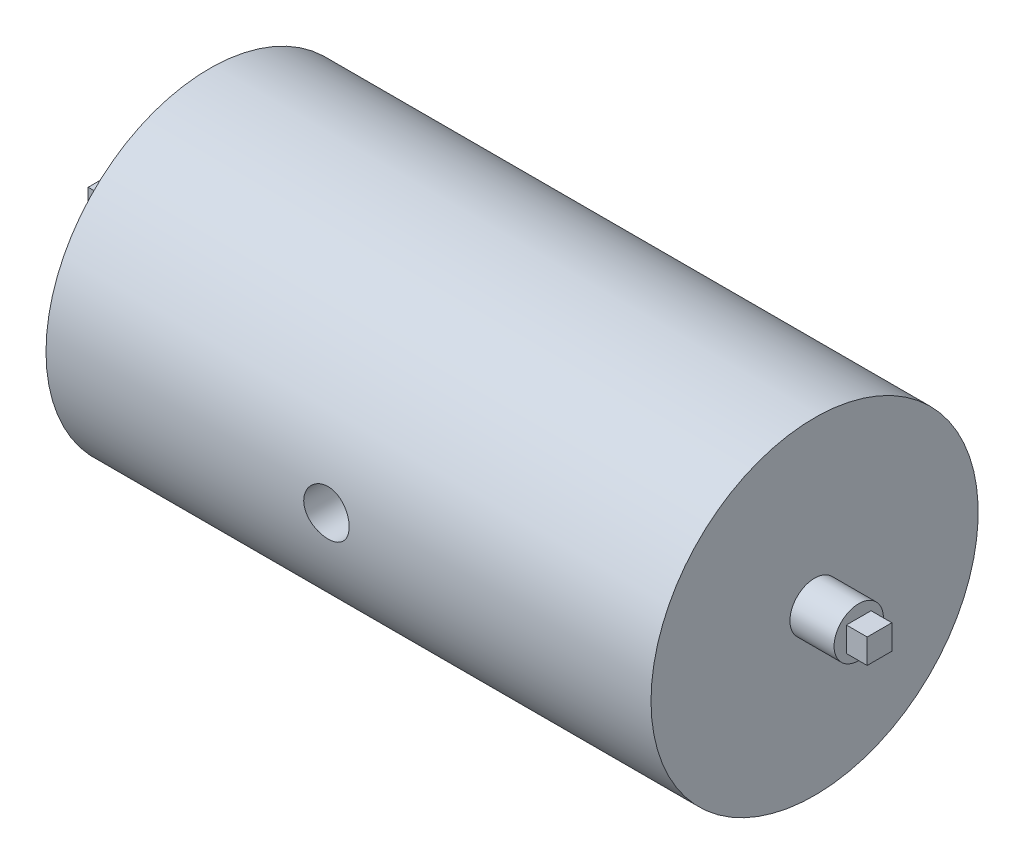
ISO-10303-21;
HEADER;
FILE_DESCRIPTION(('STEP AP214'),'2;1');
FILE_NAME('part.step','',(''),(''),'','','');
FILE_SCHEMA(('AUTOMOTIVE_DESIGN { 1 0 10303 214 1 1 1 1 }'));
ENDSEC;
DATA;
#1=APPLICATION_CONTEXT('core data for automotive mechanical design processes');
#2=APPLICATION_PROTOCOL_DEFINITION('international standard','automotive_design',2000,#1);
#3=PRODUCT_CONTEXT('',#1,'mechanical');
#4=PRODUCT('Part','Part','',(#3));
#5=PRODUCT_RELATED_PRODUCT_CATEGORY('part','',(#4));
#6=PRODUCT_DEFINITION_FORMATION('','',#4);
#7=PRODUCT_DEFINITION_CONTEXT('part definition',#1,'design');
#8=PRODUCT_DEFINITION('design','',#6,#7);
#9=PRODUCT_DEFINITION_SHAPE('','',#8);
#10=(LENGTH_UNIT() NAMED_UNIT(*) SI_UNIT(.MILLI.,.METRE.));
#11=(NAMED_UNIT(*) PLANE_ANGLE_UNIT() SI_UNIT($,.RADIAN.));
#12=(NAMED_UNIT(*) SI_UNIT($,.STERADIAN.) SOLID_ANGLE_UNIT());
#13=UNCERTAINTY_MEASURE_WITH_UNIT(LENGTH_MEASURE(1.E-05),#10,'distance_accuracy_value','');
#14=(GEOMETRIC_REPRESENTATION_CONTEXT(3) GLOBAL_UNCERTAINTY_ASSIGNED_CONTEXT((#13)) GLOBAL_UNIT_ASSIGNED_CONTEXT((#10,
#11,#12)) REPRESENTATION_CONTEXT('',''));
#15=CARTESIAN_POINT('',(0.,0.,0.));
#16=DIRECTION('',(0.,0.,1.));
#17=DIRECTION('',(1.,0.,0.));
#18=AXIS2_PLACEMENT_3D('',#15,#16,#17);
#19=CARTESIAN_POINT('',(0.,0.,-4.75));
#20=DIRECTION('',(-1.,0.,0.));
#21=DIRECTION('',(0.,0.,1.));
#22=AXIS2_PLACEMENT_3D('',#19,#20,#21);
#23=CYLINDRICAL_SURFACE('',#22,31.5);
#24=CARTESIAN_POINT('',(17.,0.,-4.75));
#25=DIRECTION('',(-1.,0.,0.));
#26=DIRECTION('',(0.,0.,1.));
#27=AXIS2_PLACEMENT_3D('',#24,#25,#26);
#28=CIRCLE('',#27,31.5);
#29=CARTESIAN_POINT('',(17.,0.,26.75));
#30=VERTEX_POINT('',#29);
#31=EDGE_CURVE('E296',#30,#30,#28,.T.);
#32=ORIENTED_EDGE('',*,*,#31,.F.);
#33=EDGE_LOOP('',(#32));
#34=FACE_BOUND('',#33,.T.);
#35=CARTESIAN_POINT('',(133.5,0.,-4.75));
#36=DIRECTION('',(-1.,0.,0.));
#37=DIRECTION('',(0.,0.,1.));
#38=AXIS2_PLACEMENT_3D('',#35,#36,#37);
#39=CIRCLE('',#38,31.5);
#40=CARTESIAN_POINT('',(133.5,0.,26.75));
#41=VERTEX_POINT('',#40);
#42=EDGE_CURVE('E300',#41,#41,#39,.T.);
#43=ORIENTED_EDGE('',*,*,#42,.T.);
#44=EDGE_LOOP('',(#43));
#45=FACE_BOUND('',#44,.T.);
#46=CARTESIAN_POINT('',(63.31,0.,-4.75));
#47=DIRECTION('',(-0.866025403784438,0.5,0.));
#48=DIRECTION('',(-0.5,-0.866025403784439,0.));
#49=AXIS2_PLACEMENT_3D('',#46,#47,#48);
#50=ELLIPSE('',#49,36.3730669589464,31.5);
#51=CARTESIAN_POINT('',(63.31,0.,-36.25));
#52=VERTEX_POINT('',#51);
#53=CARTESIAN_POINT('',(67.155,6.65973535510233,-35.5379509711186));
#54=VERTEX_POINT('',#53);
#55=EDGE_CURVE('E11',#52,#54,#50,.F.);
#56=ORIENTED_EDGE('',*,*,#55,.F.);
#57=CARTESIAN_POINT('',(63.31,0.,-4.75));
#58=DIRECTION('',(-0.866025403784438,-0.5,0.));
#59=DIRECTION('',(-0.5,0.866025403784438,0.));
#60=AXIS2_PLACEMENT_3D('',#57,#58,#59);
#61=ELLIPSE('',#60,36.3730669589464,31.5);
#62=CARTESIAN_POINT('',(67.155,-6.65973535510232,-35.5379509711186));
#63=VERTEX_POINT('',#62);
#64=EDGE_CURVE('E145',#63,#52,#61,.F.);
#65=ORIENTED_EDGE('',*,*,#64,.F.);
#66=DIRECTION('',(-1.,0.,0.));
#67=VECTOR('',#66,1.);
#68=CARTESIAN_POINT('',(0.,-6.65973535510232,-35.5379509711186));
#69=LINE('',#68,#67);
#70=CARTESIAN_POINT('',(74.845,-6.65973535510233,-35.5379509711186));
#71=VERTEX_POINT('',#70);
#72=EDGE_CURVE('E318',#71,#63,#69,.T.);
#73=ORIENTED_EDGE('',*,*,#72,.F.);
#74=CARTESIAN_POINT('',(78.69,0.,-4.75));
#75=DIRECTION('',(0.866025403784438,-0.500000000000001,0.));
#76=DIRECTION('',(-0.500000000000001,-0.866025403784438,0.));
#77=AXIS2_PLACEMENT_3D('',#74,#75,#76);
#78=ELLIPSE('',#77,36.3730669589465,31.5);
#79=CARTESIAN_POINT('',(78.69,0.,-36.25));
#80=VERTEX_POINT('',#79);
#81=EDGE_CURVE('E321',#80,#71,#78,.F.);
#82=ORIENTED_EDGE('',*,*,#81,.F.);
#83=CARTESIAN_POINT('',(78.69,0.,-4.75));
#84=DIRECTION('',(0.866025403784438,0.500000000000001,0.));
#85=DIRECTION('',(-0.500000000000001,0.866025403784438,0.));
#86=AXIS2_PLACEMENT_3D('',#83,#84,#85);
#87=ELLIPSE('',#86,36.3730669589465,31.5);
#88=CARTESIAN_POINT('',(74.845,6.65973535510233,-35.5379509711186));
#89=VERTEX_POINT('',#88);
#90=EDGE_CURVE('E324',#89,#80,#87,.F.);
#91=ORIENTED_EDGE('',*,*,#90,.F.);
#92=DIRECTION('',(-1.,0.,0.));
#93=VECTOR('',#92,1.);
#94=CARTESIAN_POINT('',(0.,6.65973535510233,-35.5379509711186));
#95=LINE('',#94,#93);
#96=EDGE_CURVE('E50',#54,#89,#95,.F.);
#97=ORIENTED_EDGE('',*,*,#96,.F.);
#98=EDGE_LOOP('',(#56,#65,#73,#82,#91,#97));
#99=FACE_BOUND('',#98,.T.);
#100=CARTESIAN_POINT('',(75.375,0.,26.75));
#101=CARTESIAN_POINT('',(75.374989767447,-0.244483551436178,26.7499962939464));
#102=CARTESIAN_POINT('',(75.3544375252358,-0.489114067436838,26.7471237668412));
#103=CARTESIAN_POINT('',(75.2727842816762,-0.971551559779698,26.7359410700169));
#104=CARTESIAN_POINT('',(75.2116424643773,-1.20935141599318,26.7276254269425));
#105=CARTESIAN_POINT('',(75.05066018136,-1.67107477619038,26.7064920687307));
#106=CARTESIAN_POINT('',(74.9508474793569,-1.89500810215663,26.6936775841491));
#107=CARTESIAN_POINT('',(74.7154213822643,-2.32290865123324,26.6649668352355));
#108=CARTESIAN_POINT('',(74.5798135016511,-2.52687894314762,26.6490710456983));
#109=CARTESIAN_POINT('',(74.2756713922518,-2.91047601892358,26.6158488784394));
#110=CARTESIAN_POINT('',(74.1069438062952,-3.08994881576681,26.5985144624671));
#111=CARTESIAN_POINT('',(73.7417676329772,-3.41812881902964,26.5644325282382));
#112=CARTESIAN_POINT('',(73.5453175397683,-3.56683435313224,26.5476850419244));
#113=CARTESIAN_POINT('',(73.1292533656299,-3.82984651489176,26.5165948068557));
#114=CARTESIAN_POINT('',(72.9095456008888,-3.94400627520036,26.5022624369139));
#115=CARTESIAN_POINT('',(72.4538432826695,-4.13374806735286,26.4777334406268));
#116=CARTESIAN_POINT('',(72.2178494904063,-4.20933190086564,26.4675366211372));
#117=CARTESIAN_POINT('',(71.7378844694508,-4.31930264464039,26.4525113803306));
#118=CARTESIAN_POINT('',(71.4939743744283,-4.35395162417458,26.4476488229923));
#119=CARTESIAN_POINT('',(71.0037569047689,-4.38188053849133,26.4437386961765));
#120=CARTESIAN_POINT('',(70.7574496490592,-4.37516251522451,26.4446908396748));
#121=CARTESIAN_POINT('',(70.2712692314071,-4.32076273310391,26.4522713015555));
#122=CARTESIAN_POINT('',(70.0313628613332,-4.27337135157993,26.4588593824905));
#123=CARTESIAN_POINT('',(69.5629408298947,-4.1394239787597,26.476906608034));
#124=CARTESIAN_POINT('',(69.3344254485566,-4.05286702517735,26.4883658723255));
#125=CARTESIAN_POINT('',(68.8943799497153,-3.84273883982006,26.5149093040031));
#126=CARTESIAN_POINT('',(68.6829100361665,-3.71904312870982,26.5300056276965));
#127=CARTESIAN_POINT('',(68.2836186342777,-3.43823752635319,26.5621131546397));
#128=CARTESIAN_POINT('',(68.0957984801555,-3.28112575125934,26.5791244658226));
#129=CARTESIAN_POINT('',(67.7474540060754,-2.93634675293564,26.6133235373442));
#130=CARTESIAN_POINT('',(67.5871770071602,-2.74842957266265,26.6305115619595));
#131=CARTESIAN_POINT('',(67.3003999789738,-2.34823000708547,26.6629917735905));
#132=CARTESIAN_POINT('',(67.1739000620081,-2.13594754077249,26.6782839543026));
#133=CARTESIAN_POINT('',(66.9582612193736,-1.69283998356401,26.7052622724266));
#134=CARTESIAN_POINT('',(66.8691396967676,-1.46200631485416,26.7169467294466));
#135=CARTESIAN_POINT('',(66.7309937477096,-0.988451162914559,26.7353785505929));
#136=CARTESIAN_POINT('',(66.6819670003538,-0.745730368638471,26.7421262004861));
#137=CARTESIAN_POINT('',(66.625727275009,-0.257427277582794,26.7498866180772));
#138=CARTESIAN_POINT('',(66.6181739670612,-0.0118848914878023,26.7509460614498));
#139=CARTESIAN_POINT('',(66.644194617917,0.476962578938893,26.7473372702792));
#140=CARTESIAN_POINT('',(66.6777674898333,0.720267722225493,26.7426691871038));
#141=CARTESIAN_POINT('',(66.7848045946113,1.19671572758066,26.728158781835));
#142=CARTESIAN_POINT('',(66.8581046653975,1.42989617381336,26.7183377581894));
#143=CARTESIAN_POINT('',(67.0423434731979,1.8806565964868,26.6946198926065));
#144=CARTESIAN_POINT('',(67.1532837547643,2.09823593229788,26.6807228834158));
#145=CARTESIAN_POINT('',(67.4104638557968,2.51312533674921,26.6502833928764));
#146=CARTESIAN_POINT('',(67.556921552681,2.71029914553319,26.6337248043824));
#147=CARTESIAN_POINT('',(67.88067348183,3.07738960469143,26.5998599725502));
#148=CARTESIAN_POINT('',(68.0579692387055,3.24730490662658,26.5825536922785));
#149=CARTESIAN_POINT('',(68.4398723135493,3.55627910064402,26.5489978358134));
#150=CARTESIAN_POINT('',(68.6446641067514,3.69511101668964,26.5327566084069));
#151=CARTESIAN_POINT('',(69.074860064788,3.93640434280411,26.5033127706346));
#152=CARTESIAN_POINT('',(69.3002637372169,4.03886662143664,26.4901100877063));
#153=CARTESIAN_POINT('',(69.7645824102466,4.20415300010695,26.468297090839));
#154=CARTESIAN_POINT('',(70.0034527797991,4.26710050960641,26.4596724921439));
#155=CARTESIAN_POINT('',(70.488502180221,4.35196557427412,26.447952843011));
#156=CARTESIAN_POINT('',(70.7346807831746,4.3738855269163,26.4448574694696));
#157=CARTESIAN_POINT('',(71.2250983401101,4.37602228287063,26.4445576057088));
#158=CARTESIAN_POINT('',(71.4693357847706,4.35659580444575,26.4473027262805));
#159=CARTESIAN_POINT('',(71.9510361294516,4.27735135923921,26.4582655868275));
#160=CARTESIAN_POINT('',(72.1884990345046,4.21753342246266,26.4664833227374));
#161=CARTESIAN_POINT('',(72.6498348026537,4.05932353180831,26.4874488113869));
#162=CARTESIAN_POINT('',(72.8737151094778,3.96095293070782,26.5001940561556));
#163=CARTESIAN_POINT('',(73.3018505421083,3.72846521955434,26.5287820156806));
#164=CARTESIAN_POINT('',(73.5061051964201,3.59434725098419,26.5446248048257));
#165=CARTESIAN_POINT('',(73.8910091989072,3.29286265200486,26.5777860418109));
#166=CARTESIAN_POINT('',(74.0714499752786,3.12523093374305,26.5951155822017));
#167=CARTESIAN_POINT('',(74.4017710052008,2.76203584618229,26.629202587307));
#168=CARTESIAN_POINT('',(74.5516441028606,2.56646595473814,26.6459599173045));
#169=CARTESIAN_POINT('',(74.8171918419093,2.15187679652751,26.6771030635672));
#170=CARTESIAN_POINT('',(74.9327027267489,1.93275181197701,26.6914773839249));
#171=CARTESIAN_POINT('',(75.1251146130084,1.47812489689791,26.7161208895794));
#172=CARTESIAN_POINT('',(75.2020565239878,1.24264062169142,26.726394422156));
#173=CARTESIAN_POINT('',(75.2972394541755,0.838351544663169,26.7392719999721));
#174=CARTESIAN_POINT('',(75.3263563489892,0.672068838629243,26.743274838411));
#175=CARTESIAN_POINT('',(75.3652400551769,0.337214048921173,26.7486401035394));
#176=CARTESIAN_POINT('',(75.3750070582993,0.168641987950137,26.7500025563939));
#177=CARTESIAN_POINT('',(75.375,0.,26.75));
#178=B_SPLINE_CURVE_WITH_KNOTS('',3,(#100,#101,#102,#103,#104,#105,#106,#107,#108,#109,#110,
#111,#112,#113,#114,#115,#116,#117,#118,#119,#120,#121,#122,#123,#124,#125,#126,#127,#128,#129,
#130,#131,#132,#133,#134,#135,#136,#137,#138,#139,#140,#141,#142,#143,#144,#145,#146,#147,#148,
#149,#150,#151,#152,#153,#154,#155,#156,#157,#158,#159,#160,#161,#162,#163,#164,#165,#166,#167,
#168,#169,#170,#171,#172,#173,#174,#175,#176,#177),.UNSPECIFIED.,.T.,.F.,(4,2,2,2,2,2,2,2,2,2,2,
2,2,2,2,2,2,2,2,2,2,2,2,2,2,2,2,2,2,2,2,2,2,2,2,2,2,2,4),(0.,0.732834532707116,1.46640710560907,
2.19945398401452,2.93238799770189,3.66973556322692,4.40712319585619,5.14760307348409,
5.88804836421318,6.62372710503621,7.35936953170744,8.08980329947269,8.82025501474624,
9.55318287417539,10.2861520637394,11.0253932220231,11.7646368381788,12.5042242588164,
13.243768865079,13.9772356151546,14.7106829815068,15.4411224259943,16.1715918474191,
16.9066609325545,17.6417663692943,18.3820762511418,19.1223684520443,19.8603369742038,
20.598262371311,21.3298471029177,22.0614312910616,22.7926108553465,23.5238079813938,
24.2610354763769,24.9984353586611,25.7392950788736,26.4793673081301,26.9848732876236,
27.4903742577636),.UNSPECIFIED.);
#179=CARTESIAN_POINT('',(75.375,0.,26.75));
#180=VERTEX_POINT('',#179);
#181=EDGE_CURVE('E168',#180,#180,#178,.T.);
#182=ORIENTED_EDGE('',*,*,#181,.T.);
#183=EDGE_LOOP('',(#182));
#184=FACE_BOUND('',#183,.T.);
#185=ADVANCED_FACE('F41',(#34,#45,#99,#184),#23,.T.);
#186=CARTESIAN_POINT('',(0.,0.,-4.75));
#187=DIRECTION('',(-1.,0.,0.));
#188=DIRECTION('',(0.,0.,1.));
#189=AXIS2_PLACEMENT_3D('',#186,#187,#188);
#190=CYLINDRICAL_SURFACE('',#189,4.75);
#191=CARTESIAN_POINT('',(17.,0.,-4.75));
#192=DIRECTION('',(-1.,0.,0.));
#193=DIRECTION('',(0.,0.,1.));
#194=AXIS2_PLACEMENT_3D('',#191,#192,#193);
#195=CIRCLE('',#194,4.75);
#196=CARTESIAN_POINT('',(17.,0.,0.));
#197=VERTEX_POINT('',#196);
#198=EDGE_CURVE('E292',#197,#197,#195,.T.);
#199=ORIENTED_EDGE('',*,*,#198,.T.);
#200=EDGE_LOOP('',(#199));
#201=FACE_BOUND('',#200,.T.);
#202=CARTESIAN_POINT('',(0.,0.,-4.75));
#203=DIRECTION('',(-1.,0.,0.));
#204=DIRECTION('',(0.,0.,1.));
#205=AXIS2_PLACEMENT_3D('',#202,#203,#204);
#206=CIRCLE('',#205,4.75);
#207=CARTESIAN_POINT('',(0.,0.,0.));
#208=VERTEX_POINT('',#207);
#209=EDGE_CURVE('E312',#208,#208,#206,.T.);
#210=ORIENTED_EDGE('',*,*,#209,.F.);
#211=EDGE_LOOP('',(#210));
#212=FACE_BOUND('',#211,.T.);
#213=ADVANCED_FACE('F43',(#201,#212),#190,.T.);
#214=CARTESIAN_POINT('',(0.,0.,0.));
#215=DIRECTION('',(-1.,0.,0.));
#216=DIRECTION('',(0.,0.,1.));
#217=AXIS2_PLACEMENT_3D('',#214,#215,#216);
#218=PLANE('',#217);
#219=DIRECTION('',(0.,0.,-1.));
#220=VECTOR('',#219,1.);
#221=CARTESIAN_POINT('',(0.,2.375,-4.75));
#222=LINE('',#221,#220);
#223=CARTESIAN_POINT('',(0.,2.375,-2.375));
#224=VERTEX_POINT('',#223);
#225=CARTESIAN_POINT('',(0.,2.375,-7.125));
#226=VERTEX_POINT('',#225);
#227=EDGE_CURVE('E65',#224,#226,#222,.T.);
#228=ORIENTED_EDGE('',*,*,#227,.F.);
#229=DIRECTION('',(0.,1.,0.));
#230=VECTOR('',#229,1.);
#231=CARTESIAN_POINT('',(0.,-2.375,-2.375));
#232=LINE('',#231,#230);
#233=CARTESIAN_POINT('',(0.,-2.375,-2.375));
#234=VERTEX_POINT('',#233);
#235=EDGE_CURVE('E210',#234,#224,#232,.T.);
#236=ORIENTED_EDGE('',*,*,#235,.F.);
#237=DIRECTION('',(0.,0.,1.));
#238=VECTOR('',#237,1.);
#239=CARTESIAN_POINT('',(0.,-2.375,-7.125));
#240=LINE('',#239,#238);
#241=CARTESIAN_POINT('',(0.,-2.375,-7.125));
#242=VERTEX_POINT('',#241);
#243=EDGE_CURVE('E226',#242,#234,#240,.T.);
#244=ORIENTED_EDGE('',*,*,#243,.F.);
#245=DIRECTION('',(0.,-1.,0.));
#246=VECTOR('',#245,1.);
#247=CARTESIAN_POINT('',(0.,2.375,-7.125));
#248=LINE('',#247,#246);
#249=EDGE_CURVE('E222',#226,#242,#248,.T.);
#250=ORIENTED_EDGE('',*,*,#249,.F.);
#251=EDGE_LOOP('',(#228,#236,#244,#250));
#252=FACE_BOUND('',#251,.T.);
#253=ORIENTED_EDGE('',*,*,#209,.T.);
#254=EDGE_LOOP('',(#253));
#255=FACE_BOUND('',#254,.T.);
#256=ADVANCED_FACE('F358',(#252,#255),#218,.T.);
#257=CARTESIAN_POINT('',(142.,0.,-4.75));
#258=DIRECTION('',(1.,0.,0.));
#259=DIRECTION('',(0.,0.,-1.));
#260=AXIS2_PLACEMENT_3D('',#257,#258,#259);
#261=PLANE('',#260);
#262=DIRECTION('',(0.,0.,1.));
#263=VECTOR('',#262,1.);
#264=CARTESIAN_POINT('',(142.,2.375,-2.375));
#265=LINE('',#264,#263);
#266=CARTESIAN_POINT('',(142.,2.375,-7.125));
#267=VERTEX_POINT('',#266);
#268=CARTESIAN_POINT('',(142.,2.375,-2.375));
#269=VERTEX_POINT('',#268);
#270=EDGE_CURVE('E247',#267,#269,#265,.T.);
#271=ORIENTED_EDGE('',*,*,#270,.F.);
#272=DIRECTION('',(0.,1.,0.));
#273=VECTOR('',#272,1.);
#274=CARTESIAN_POINT('',(142.,2.375,-7.125));
#275=LINE('',#274,#273);
#276=CARTESIAN_POINT('',(142.,-2.375,-7.125));
#277=VERTEX_POINT('',#276);
#278=EDGE_CURVE('E253',#277,#267,#275,.T.);
#279=ORIENTED_EDGE('',*,*,#278,.F.);
#280=DIRECTION('',(0.,0.,-1.));
#281=VECTOR('',#280,1.);
#282=CARTESIAN_POINT('',(142.,-2.375,-7.125));
#283=LINE('',#282,#281);
#284=CARTESIAN_POINT('',(142.,-2.375,-2.375));
#285=VERTEX_POINT('',#284);
#286=EDGE_CURVE('E270',#285,#277,#283,.T.);
#287=ORIENTED_EDGE('',*,*,#286,.F.);
#288=DIRECTION('',(0.,-1.,0.));
#289=VECTOR('',#288,1.);
#290=CARTESIAN_POINT('',(142.,2.375,-2.375));
#291=LINE('',#290,#289);
#292=EDGE_CURVE('E266',#269,#285,#291,.T.);
#293=ORIENTED_EDGE('',*,*,#292,.F.);
#294=EDGE_LOOP('',(#271,#279,#287,#293));
#295=FACE_BOUND('',#294,.T.);
#296=CARTESIAN_POINT('',(142.,0.,-4.75));
#297=DIRECTION('',(-1.,0.,0.));
#298=DIRECTION('',(0.,0.,1.));
#299=AXIS2_PLACEMENT_3D('',#296,#297,#298);
#300=CIRCLE('',#299,4.75);
#301=CARTESIAN_POINT('',(142.,0.,0.));
#302=VERTEX_POINT('',#301);
#303=EDGE_CURVE('E308',#302,#302,#300,.T.);
#304=ORIENTED_EDGE('',*,*,#303,.F.);
#305=EDGE_LOOP('',(#304));
#306=FACE_BOUND('',#305,.T.);
#307=ADVANCED_FACE('F374',(#295,#306),#261,.T.);
#308=CARTESIAN_POINT('',(0.,0.,-4.75));
#309=DIRECTION('',(-1.,0.,0.));
#310=DIRECTION('',(0.,0.,1.));
#311=AXIS2_PLACEMENT_3D('',#308,#309,#310);
#312=CYLINDRICAL_SURFACE('',#311,4.75);
#313=ORIENTED_EDGE('',*,*,#303,.T.);
#314=EDGE_LOOP('',(#313));
#315=FACE_BOUND('',#314,.T.);
#316=CARTESIAN_POINT('',(133.5,0.,-4.75));
#317=DIRECTION('',(-1.,0.,0.));
#318=DIRECTION('',(0.,0.,1.));
#319=AXIS2_PLACEMENT_3D('',#316,#317,#318);
#320=CIRCLE('',#319,4.75);
#321=CARTESIAN_POINT('',(133.5,0.,0.));
#322=VERTEX_POINT('',#321);
#323=EDGE_CURVE('E304',#322,#322,#320,.T.);
#324=ORIENTED_EDGE('',*,*,#323,.F.);
#325=EDGE_LOOP('',(#324));
#326=FACE_BOUND('',#325,.T.);
#327=ADVANCED_FACE('F370',(#315,#326),#312,.T.);
#328=CARTESIAN_POINT('',(133.5,0.,0.));
#329=DIRECTION('',(1.,0.,0.));
#330=DIRECTION('',(0.,0.,-1.));
#331=AXIS2_PLACEMENT_3D('',#328,#329,#330);
#332=PLANE('',#331);
#333=ORIENTED_EDGE('',*,*,#323,.T.);
#334=EDGE_LOOP('',(#333));
#335=FACE_BOUND('',#334,.T.);
#336=ORIENTED_EDGE('',*,*,#42,.F.);
#337=EDGE_LOOP('',(#336));
#338=FACE_BOUND('',#337,.T.);
#339=ADVANCED_FACE('F367',(#335,#338),#332,.T.);
#340=CARTESIAN_POINT('',(17.,0.,26.75));
#341=DIRECTION('',(-1.,0.,0.));
#342=DIRECTION('',(0.,0.,1.));
#343=AXIS2_PLACEMENT_3D('',#340,#341,#342);
#344=PLANE('',#343);
#345=ORIENTED_EDGE('',*,*,#31,.T.);
#346=EDGE_LOOP('',(#345));
#347=FACE_BOUND('',#346,.T.);
#348=ORIENTED_EDGE('',*,*,#198,.F.);
#349=EDGE_LOOP('',(#348));
#350=FACE_BOUND('',#349,.T.);
#351=ADVANCED_FACE('F365',(#347,#350),#344,.T.);
#352=CARTESIAN_POINT('',(146.,2.375,-2.375));
#353=DIRECTION('',(0.,-1.,0.));
#354=DIRECTION('',(0.,0.,-1.));
#355=AXIS2_PLACEMENT_3D('',#352,#353,#354);
#356=PLANE('',#355);
#357=ORIENTED_EDGE('',*,*,#270,.T.);
#358=DIRECTION('',(-1.,0.,0.));
#359=VECTOR('',#358,1.);
#360=CARTESIAN_POINT('',(146.,2.375,-2.375));
#361=LINE('',#360,#359);
#362=CARTESIAN_POINT('',(146.,2.375,-2.375));
#363=VERTEX_POINT('',#362);
#364=EDGE_CURVE('E288',#363,#269,#361,.T.);
#365=ORIENTED_EDGE('',*,*,#364,.F.);
#366=DIRECTION('',(0.,0.,1.));
#367=VECTOR('',#366,1.);
#368=CARTESIAN_POINT('',(146.,2.375,-2.375));
#369=LINE('',#368,#367);
#370=CARTESIAN_POINT('',(146.,2.375,-7.125));
#371=VERTEX_POINT('',#370);
#372=EDGE_CURVE('E248',#371,#363,#369,.T.);
#373=ORIENTED_EDGE('',*,*,#372,.F.);
#374=DIRECTION('',(-1.,0.,0.));
#375=VECTOR('',#374,1.);
#376=CARTESIAN_POINT('',(146.,2.375,-7.125));
#377=LINE('',#376,#375);
#378=EDGE_CURVE('E262',#371,#267,#377,.T.);
#379=ORIENTED_EDGE('',*,*,#378,.T.);
#380=EDGE_LOOP('',(#357,#365,#373,#379));
#381=FACE_BOUND('',#380,.T.);
#382=ADVANCED_FACE('F406',(#381),#356,.F.);
#383=CARTESIAN_POINT('',(146.,2.375,-2.375));
#384=DIRECTION('',(0.,0.,-1.));
#385=DIRECTION('',(0.,1.,0.));
#386=AXIS2_PLACEMENT_3D('',#383,#384,#385);
#387=PLANE('',#386);
#388=ORIENTED_EDGE('',*,*,#292,.T.);
#389=DIRECTION('',(-1.,0.,0.));
#390=VECTOR('',#389,1.);
#391=CARTESIAN_POINT('',(146.,-2.375,-2.375));
#392=LINE('',#391,#390);
#393=CARTESIAN_POINT('',(146.,-2.375,-2.375));
#394=VERTEX_POINT('',#393);
#395=EDGE_CURVE('E284',#394,#285,#392,.T.);
#396=ORIENTED_EDGE('',*,*,#395,.F.);
#397=DIRECTION('',(0.,-1.,0.));
#398=VECTOR('',#397,1.);
#399=CARTESIAN_POINT('',(146.,2.375,-2.375));
#400=LINE('',#399,#398);
#401=EDGE_CURVE('E252',#363,#394,#400,.T.);
#402=ORIENTED_EDGE('',*,*,#401,.F.);
#403=ORIENTED_EDGE('',*,*,#364,.T.);
#404=EDGE_LOOP('',(#388,#396,#402,#403));
#405=FACE_BOUND('',#404,.T.);
#406=ADVANCED_FACE('F413',(#405),#387,.F.);
#407=CARTESIAN_POINT('',(146.,-2.375,-7.125));
#408=DIRECTION('',(0.,1.,0.));
#409=DIRECTION('',(0.,0.,1.));
#410=AXIS2_PLACEMENT_3D('',#407,#408,#409);
#411=PLANE('',#410);
#412=ORIENTED_EDGE('',*,*,#286,.T.);
#413=DIRECTION('',(-1.,0.,0.));
#414=VECTOR('',#413,1.);
#415=CARTESIAN_POINT('',(146.,-2.375,-7.125));
#416=LINE('',#415,#414);
#417=CARTESIAN_POINT('',(146.,-2.375,-7.125));
#418=VERTEX_POINT('',#417);
#419=EDGE_CURVE('E280',#418,#277,#416,.T.);
#420=ORIENTED_EDGE('',*,*,#419,.F.);
#421=DIRECTION('',(0.,0.,-1.));
#422=VECTOR('',#421,1.);
#423=CARTESIAN_POINT('',(146.,-2.375,-7.125));
#424=LINE('',#423,#422);
#425=EDGE_CURVE('E256',#394,#418,#424,.T.);
#426=ORIENTED_EDGE('',*,*,#425,.F.);
#427=ORIENTED_EDGE('',*,*,#395,.T.);
#428=EDGE_LOOP('',(#412,#420,#426,#427));
#429=FACE_BOUND('',#428,.T.);
#430=ADVANCED_FACE('F420',(#429),#411,.F.);
#431=CARTESIAN_POINT('',(146.,2.375,-7.125));
#432=DIRECTION('',(0.,0.,1.));
#433=DIRECTION('',(1.,0.,0.));
#434=AXIS2_PLACEMENT_3D('',#431,#432,#433);
#435=PLANE('',#434);
#436=ORIENTED_EDGE('',*,*,#278,.T.);
#437=ORIENTED_EDGE('',*,*,#378,.F.);
#438=DIRECTION('',(0.,1.,0.));
#439=VECTOR('',#438,1.);
#440=CARTESIAN_POINT('',(146.,2.375,-7.125));
#441=LINE('',#440,#439);
#442=EDGE_CURVE('E259',#418,#371,#441,.T.);
#443=ORIENTED_EDGE('',*,*,#442,.F.);
#444=ORIENTED_EDGE('',*,*,#419,.T.);
#445=EDGE_LOOP('',(#436,#437,#443,#444));
#446=FACE_BOUND('',#445,.T.);
#447=ADVANCED_FACE('F428',(#446),#435,.F.);
#448=CARTESIAN_POINT('',(146.,0.,0.));
#449=DIRECTION('',(-1.,0.,0.));
#450=DIRECTION('',(0.,0.,1.));
#451=AXIS2_PLACEMENT_3D('',#448,#449,#450);
#452=PLANE('',#451);
#453=ORIENTED_EDGE('',*,*,#372,.T.);
#454=ORIENTED_EDGE('',*,*,#401,.T.);
#455=ORIENTED_EDGE('',*,*,#425,.T.);
#456=ORIENTED_EDGE('',*,*,#442,.T.);
#457=EDGE_LOOP('',(#453,#454,#455,#456));
#458=FACE_BOUND('',#457,.T.);
#459=ADVANCED_FACE('F436',(#458),#452,.F.);
#460=CARTESIAN_POINT('',(-4.,2.375,-4.75));
#461=DIRECTION('',(0.,-1.,0.));
#462=DIRECTION('',(0.,0.,-1.));
#463=AXIS2_PLACEMENT_3D('',#460,#461,#462);
#464=PLANE('',#463);
#465=ORIENTED_EDGE('',*,*,#227,.T.);
#466=DIRECTION('',(1.,0.,0.));
#467=VECTOR('',#466,1.);
#468=CARTESIAN_POINT('',(-4.,2.375,-7.125));
#469=LINE('',#468,#467);
#470=CARTESIAN_POINT('',(-4.,2.375,-7.125));
#471=VERTEX_POINT('',#470);
#472=EDGE_CURVE('E243',#471,#226,#469,.T.);
#473=ORIENTED_EDGE('',*,*,#472,.F.);
#474=DIRECTION('',(0.,0.,-1.));
#475=VECTOR('',#474,1.);
#476=CARTESIAN_POINT('',(-4.,2.375,-2.375));
#477=LINE('',#476,#475);
#478=CARTESIAN_POINT('',(-4.,2.375,-2.375));
#479=VERTEX_POINT('',#478);
#480=EDGE_CURVE('E206',#479,#471,#477,.T.);
#481=ORIENTED_EDGE('',*,*,#480,.F.);
#482=DIRECTION('',(1.,0.,0.));
#483=VECTOR('',#482,1.);
#484=CARTESIAN_POINT('',(-4.,2.375,-2.375));
#485=LINE('',#484,#483);
#486=EDGE_CURVE('E219',#479,#224,#485,.T.);
#487=ORIENTED_EDGE('',*,*,#486,.T.);
#488=EDGE_LOOP('',(#465,#473,#481,#487));
#489=FACE_BOUND('',#488,.T.);
#490=ADVANCED_FACE('F444',(#489),#464,.F.);
#491=CARTESIAN_POINT('',(-4.,2.375,-7.125));
#492=DIRECTION('',(0.,0.,1.));
#493=DIRECTION('',(1.,0.,0.));
#494=AXIS2_PLACEMENT_3D('',#491,#492,#493);
#495=PLANE('',#494);
#496=ORIENTED_EDGE('',*,*,#249,.T.);
#497=DIRECTION('',(1.,0.,0.));
#498=VECTOR('',#497,1.);
#499=CARTESIAN_POINT('',(-4.,-2.375,-7.125));
#500=LINE('',#499,#498);
#501=CARTESIAN_POINT('',(-4.,-2.375,-7.125));
#502=VERTEX_POINT('',#501);
#503=EDGE_CURVE('E239',#502,#242,#500,.T.);
#504=ORIENTED_EDGE('',*,*,#503,.F.);
#505=DIRECTION('',(0.,-1.,0.));
#506=VECTOR('',#505,1.);
#507=CARTESIAN_POINT('',(-4.,2.375,-7.125));
#508=LINE('',#507,#506);
#509=EDGE_CURVE('E209',#471,#502,#508,.T.);
#510=ORIENTED_EDGE('',*,*,#509,.F.);
#511=ORIENTED_EDGE('',*,*,#472,.T.);
#512=EDGE_LOOP('',(#496,#504,#510,#511));
#513=FACE_BOUND('',#512,.T.);
#514=ADVANCED_FACE('F451',(#513),#495,.F.);
#515=CARTESIAN_POINT('',(-4.,-2.375,-7.125));
#516=DIRECTION('',(0.,1.,0.));
#517=DIRECTION('',(0.,0.,1.));
#518=AXIS2_PLACEMENT_3D('',#515,#516,#517);
#519=PLANE('',#518);
#520=ORIENTED_EDGE('',*,*,#243,.T.);
#521=DIRECTION('',(1.,0.,0.));
#522=VECTOR('',#521,1.);
#523=CARTESIAN_POINT('',(-4.,-2.375,-2.375));
#524=LINE('',#523,#522);
#525=CARTESIAN_POINT('',(-4.,-2.375,-2.375));
#526=VERTEX_POINT('',#525);
#527=EDGE_CURVE('E235',#526,#234,#524,.T.);
#528=ORIENTED_EDGE('',*,*,#527,.F.);
#529=DIRECTION('',(0.,0.,1.));
#530=VECTOR('',#529,1.);
#531=CARTESIAN_POINT('',(-4.,-2.375,-7.125));
#532=LINE('',#531,#530);
#533=EDGE_CURVE('E213',#502,#526,#532,.T.);
#534=ORIENTED_EDGE('',*,*,#533,.F.);
#535=ORIENTED_EDGE('',*,*,#503,.T.);
#536=EDGE_LOOP('',(#520,#528,#534,#535));
#537=FACE_BOUND('',#536,.T.);
#538=ADVANCED_FACE('F458',(#537),#519,.F.);
#539=CARTESIAN_POINT('',(-4.,-2.375,-2.375));
#540=DIRECTION('',(0.,0.,-1.));
#541=DIRECTION('',(-1.,0.,0.));
#542=AXIS2_PLACEMENT_3D('',#539,#540,#541);
#543=PLANE('',#542);
#544=ORIENTED_EDGE('',*,*,#235,.T.);
#545=ORIENTED_EDGE('',*,*,#486,.F.);
#546=DIRECTION('',(0.,1.,0.));
#547=VECTOR('',#546,1.);
#548=CARTESIAN_POINT('',(-4.,-2.375,-2.375));
#549=LINE('',#548,#547);
#550=EDGE_CURVE('E216',#526,#479,#549,.T.);
#551=ORIENTED_EDGE('',*,*,#550,.F.);
#552=ORIENTED_EDGE('',*,*,#527,.T.);
#553=EDGE_LOOP('',(#544,#545,#551,#552));
#554=FACE_BOUND('',#553,.T.);
#555=ADVANCED_FACE('F466',(#554),#543,.F.);
#556=CARTESIAN_POINT('',(-4.,0.,0.));
#557=DIRECTION('',(-1.,0.,0.));
#558=DIRECTION('',(0.,0.,1.));
#559=AXIS2_PLACEMENT_3D('',#556,#557,#558);
#560=PLANE('',#559);
#561=ORIENTED_EDGE('',*,*,#480,.T.);
#562=ORIENTED_EDGE('',*,*,#509,.T.);
#563=ORIENTED_EDGE('',*,*,#533,.T.);
#564=ORIENTED_EDGE('',*,*,#550,.T.);
#565=EDGE_LOOP('',(#561,#562,#563,#564));
#566=FACE_BOUND('',#565,.T.);
#567=ADVANCED_FACE('F474',(#566),#560,.T.);
#568=CARTESIAN_POINT('',(67.155,6.65973535510233,-50.));
#569=DIRECTION('',(-0.866025403784438,0.5,0.));
#570=DIRECTION('',(-0.5,-0.866025403784439,0.));
#571=AXIS2_PLACEMENT_3D('',#568,#569,#570);
#572=PLANE('',#571);
#573=ORIENTED_EDGE('',*,*,#55,.T.);
#574=DIRECTION('',(0.,0.,1.));
#575=VECTOR('',#574,1.);
#576=CARTESIAN_POINT('',(67.155,6.65973535510233,-50.));
#577=LINE('',#576,#575);
#578=CARTESIAN_POINT('',(67.155,6.65973535510233,0.));
#579=VERTEX_POINT('',#578);
#580=EDGE_CURVE('E166',#54,#579,#577,.T.);
#581=ORIENTED_EDGE('',*,*,#580,.T.);
#582=DIRECTION('',(-0.5,-0.866025403784438,0.));
#583=VECTOR('',#582,1.);
#584=CARTESIAN_POINT('',(67.155,6.65973535510233,0.));
#585=LINE('',#584,#583);
#586=CARTESIAN_POINT('',(63.31,0.,0.));
#587=VERTEX_POINT('',#586);
#588=EDGE_CURVE('E157',#579,#587,#585,.T.);
#589=ORIENTED_EDGE('',*,*,#588,.T.);
#590=DIRECTION('',(0.,0.,1.));
#591=VECTOR('',#590,1.);
#592=CARTESIAN_POINT('',(63.31,0.,-50.));
#593=LINE('',#592,#591);
#594=EDGE_CURVE('E140',#52,#587,#593,.T.);
#595=ORIENTED_EDGE('',*,*,#594,.F.);
#596=EDGE_LOOP('',(#573,#581,#589,#595));
#597=FACE_BOUND('',#596,.T.);
#598=ADVANCED_FACE('F164',(#597),#572,.F.);
#599=CARTESIAN_POINT('',(74.845,6.65973535510233,-50.));
#600=DIRECTION('',(0.,1.,0.));
#601=DIRECTION('',(0.,0.,1.));
#602=AXIS2_PLACEMENT_3D('',#599,#600,#601);
#603=PLANE('',#602);
#604=ORIENTED_EDGE('',*,*,#96,.T.);
#605=DIRECTION('',(0.,0.,1.));
#606=VECTOR('',#605,1.);
#607=CARTESIAN_POINT('',(74.845,6.65973535510233,-50.));
#608=LINE('',#607,#606);
#609=CARTESIAN_POINT('',(74.845,6.65973535510233,0.));
#610=VERTEX_POINT('',#609);
#611=EDGE_CURVE('E195',#89,#610,#608,.T.);
#612=ORIENTED_EDGE('',*,*,#611,.T.);
#613=DIRECTION('',(-1.,0.,0.));
#614=VECTOR('',#613,1.);
#615=CARTESIAN_POINT('',(74.845,6.65973535510233,0.));
#616=LINE('',#615,#614);
#617=EDGE_CURVE('E150',#610,#579,#616,.T.);
#618=ORIENTED_EDGE('',*,*,#617,.T.);
#619=ORIENTED_EDGE('',*,*,#580,.F.);
#620=EDGE_LOOP('',(#604,#612,#618,#619));
#621=FACE_BOUND('',#620,.T.);
#622=ADVANCED_FACE('F330',(#621),#603,.F.);
#623=CARTESIAN_POINT('',(78.69,0.,-50.));
#624=DIRECTION('',(0.866025403784438,0.500000000000001,0.));
#625=DIRECTION('',(-0.500000000000001,0.866025403784438,0.));
#626=AXIS2_PLACEMENT_3D('',#623,#624,#625);
#627=PLANE('',#626);
#628=ORIENTED_EDGE('',*,*,#90,.T.);
#629=DIRECTION('',(0.,0.,1.));
#630=VECTOR('',#629,1.);
#631=CARTESIAN_POINT('',(78.69,0.,-50.));
#632=LINE('',#631,#630);
#633=CARTESIAN_POINT('',(78.69,0.,0.));
#634=VERTEX_POINT('',#633);
#635=EDGE_CURVE('E198',#80,#634,#632,.T.);
#636=ORIENTED_EDGE('',*,*,#635,.T.);
#637=DIRECTION('',(-0.500000000000001,0.866025403784438,0.));
#638=VECTOR('',#637,1.);
#639=CARTESIAN_POINT('',(78.69,0.,0.));
#640=LINE('',#639,#638);
#641=EDGE_CURVE('E187',#634,#610,#640,.T.);
#642=ORIENTED_EDGE('',*,*,#641,.T.);
#643=ORIENTED_EDGE('',*,*,#611,.F.);
#644=EDGE_LOOP('',(#628,#636,#642,#643));
#645=FACE_BOUND('',#644,.T.);
#646=ADVANCED_FACE('F334',(#645),#627,.F.);
#647=CARTESIAN_POINT('',(74.845,-6.65973535510233,-50.));
#648=DIRECTION('',(0.866025403784438,-0.500000000000001,0.));
#649=DIRECTION('',(0.500000000000001,0.866025403784438,0.));
#650=AXIS2_PLACEMENT_3D('',#647,#648,#649);
#651=PLANE('',#650);
#652=ORIENTED_EDGE('',*,*,#81,.T.);
#653=DIRECTION('',(0.,0.,1.));
#654=VECTOR('',#653,1.);
#655=CARTESIAN_POINT('',(74.845,-6.65973535510233,-50.));
#656=LINE('',#655,#654);
#657=CARTESIAN_POINT('',(74.845,-6.65973535510233,0.));
#658=VERTEX_POINT('',#657);
#659=EDGE_CURVE('E201',#71,#658,#656,.T.);
#660=ORIENTED_EDGE('',*,*,#659,.T.);
#661=DIRECTION('',(0.500000000000001,0.866025403784438,0.));
#662=VECTOR('',#661,1.);
#663=CARTESIAN_POINT('',(74.845,-6.65973535510233,0.));
#664=LINE('',#663,#662);
#665=EDGE_CURVE('E183',#658,#634,#664,.T.);
#666=ORIENTED_EDGE('',*,*,#665,.T.);
#667=ORIENTED_EDGE('',*,*,#635,.F.);
#668=EDGE_LOOP('',(#652,#660,#666,#667));
#669=FACE_BOUND('',#668,.T.);
#670=ADVANCED_FACE('F342',(#669),#651,.F.);
#671=CARTESIAN_POINT('',(67.155,-6.65973535510232,-50.));
#672=DIRECTION('',(0.,-1.,0.));
#673=DIRECTION('',(1.,0.,0.));
#674=AXIS2_PLACEMENT_3D('',#671,#672,#673);
#675=PLANE('',#674);
#676=ORIENTED_EDGE('',*,*,#72,.T.);
#677=DIRECTION('',(0.,0.,1.));
#678=VECTOR('',#677,1.);
#679=CARTESIAN_POINT('',(67.155,-6.65973535510232,-50.));
#680=LINE('',#679,#678);
#681=CARTESIAN_POINT('',(67.155,-6.65973535510232,0.));
#682=VERTEX_POINT('',#681);
#683=EDGE_CURVE('E57',#63,#682,#680,.T.);
#684=ORIENTED_EDGE('',*,*,#683,.T.);
#685=DIRECTION('',(1.,0.,0.));
#686=VECTOR('',#685,1.);
#687=CARTESIAN_POINT('',(67.155,-6.65973535510232,0.));
#688=LINE('',#687,#686);
#689=EDGE_CURVE('E161',#682,#658,#688,.T.);
#690=ORIENTED_EDGE('',*,*,#689,.T.);
#691=ORIENTED_EDGE('',*,*,#659,.F.);
#692=EDGE_LOOP('',(#676,#684,#690,#691));
#693=FACE_BOUND('',#692,.T.);
#694=ADVANCED_FACE('F344',(#693),#675,.F.);
#695=CARTESIAN_POINT('',(63.31,0.,-50.));
#696=DIRECTION('',(-0.866025403784438,-0.5,0.));
#697=DIRECTION('',(0.5,-0.866025403784438,0.));
#698=AXIS2_PLACEMENT_3D('',#695,#696,#697);
#699=PLANE('',#698);
#700=ORIENTED_EDGE('',*,*,#64,.T.);
#701=ORIENTED_EDGE('',*,*,#594,.T.);
#702=DIRECTION('',(0.5,-0.866025403784438,0.));
#703=VECTOR('',#702,1.);
#704=CARTESIAN_POINT('',(63.31,0.,0.));
#705=LINE('',#704,#703);
#706=EDGE_CURVE('E143',#587,#682,#705,.T.);
#707=ORIENTED_EDGE('',*,*,#706,.T.);
#708=ORIENTED_EDGE('',*,*,#683,.F.);
#709=EDGE_LOOP('',(#700,#701,#707,#708));
#710=FACE_BOUND('',#709,.T.);
#711=ADVANCED_FACE('F142',(#710),#699,.F.);
#712=CARTESIAN_POINT('',(0.,0.,0.));
#713=DIRECTION('',(0.,0.,1.));
#714=DIRECTION('',(1.,0.,0.));
#715=AXIS2_PLACEMENT_3D('',#712,#713,#714);
#716=PLANE('',#715);
#717=CARTESIAN_POINT('',(71.,0.,0.));
#718=DIRECTION('',(0.,0.,1.));
#719=DIRECTION('',(1.,0.,0.));
#720=AXIS2_PLACEMENT_3D('',#717,#718,#719);
#721=CIRCLE('',#720,4.375);
#722=CARTESIAN_POINT('',(75.375,0.,0.));
#723=VERTEX_POINT('',#722);
#724=EDGE_CURVE('E172',#723,#723,#721,.F.);
#725=ORIENTED_EDGE('',*,*,#724,.F.);
#726=EDGE_LOOP('',(#725));
#727=FACE_BOUND('',#726,.T.);
#728=ORIENTED_EDGE('',*,*,#588,.F.);
#729=ORIENTED_EDGE('',*,*,#617,.F.);
#730=ORIENTED_EDGE('',*,*,#641,.F.);
#731=ORIENTED_EDGE('',*,*,#665,.F.);
#732=ORIENTED_EDGE('',*,*,#689,.F.);
#733=ORIENTED_EDGE('',*,*,#706,.F.);
#734=EDGE_LOOP('',(#728,#729,#730,#731,#732,#733));
#735=FACE_BOUND('',#734,.T.);
#736=ADVANCED_FACE('F155',(#727,#735),#716,.F.);
#737=CARTESIAN_POINT('',(71.,0.,50.));
#738=DIRECTION('',(0.,0.,-1.));
#739=DIRECTION('',(-1.,0.,0.));
#740=AXIS2_PLACEMENT_3D('',#737,#738,#739);
#741=CYLINDRICAL_SURFACE('',#740,4.375);
#742=ORIENTED_EDGE('',*,*,#181,.F.);
#743=EDGE_LOOP('',(#742));
#744=FACE_BOUND('',#743,.T.);
#745=ORIENTED_EDGE('',*,*,#724,.T.);
#746=EDGE_LOOP('',(#745));
#747=FACE_BOUND('',#746,.T.);
#748=ADVANCED_FACE('F524',(#744,#747),#741,.F.);
#749=CLOSED_SHELL('',(#185,#213,#256,#307,#327,#339,#351,#382,#406,#430,#447,#459,#490,#514,
#538,#555,#567,#598,#622,#646,#670,#694,#711,#736,#748));
#750=MANIFOLD_SOLID_BREP('B2',#749);
#751=ADVANCED_BREP_SHAPE_REPRESENTATION('',(#18,#750),#14);
#752=SHAPE_DEFINITION_REPRESENTATION(#9,#751);
ENDSEC;
END-ISO-10303-21;
